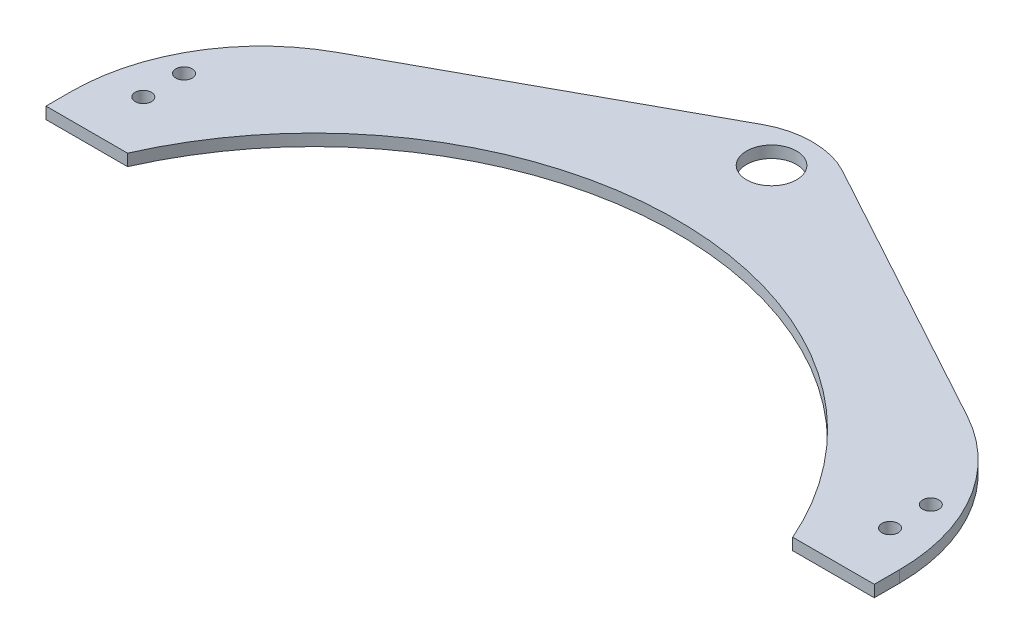
ISO-10303-21;
HEADER;
FILE_DESCRIPTION(('STEP AP214'),'2;1');
FILE_NAME('part.step','',(''),(''),'','','');
FILE_SCHEMA(('AUTOMOTIVE_DESIGN { 1 0 10303 214 1 1 1 1 }'));
ENDSEC;
DATA;
#1=APPLICATION_CONTEXT('core data for automotive mechanical design processes');
#2=APPLICATION_PROTOCOL_DEFINITION('international standard','automotive_design',2000,#1);
#3=PRODUCT_CONTEXT('',#1,'mechanical');
#4=PRODUCT('Part','Part','',(#3));
#5=PRODUCT_RELATED_PRODUCT_CATEGORY('part','',(#4));
#6=PRODUCT_DEFINITION_FORMATION('','',#4);
#7=PRODUCT_DEFINITION_CONTEXT('part definition',#1,'design');
#8=PRODUCT_DEFINITION('design','',#6,#7);
#9=PRODUCT_DEFINITION_SHAPE('','',#8);
#10=(LENGTH_UNIT() NAMED_UNIT(*) SI_UNIT(.MILLI.,.METRE.));
#11=(NAMED_UNIT(*) PLANE_ANGLE_UNIT() SI_UNIT($,.RADIAN.));
#12=(NAMED_UNIT(*) SI_UNIT($,.STERADIAN.) SOLID_ANGLE_UNIT());
#13=UNCERTAINTY_MEASURE_WITH_UNIT(LENGTH_MEASURE(1.E-05),#10,'distance_accuracy_value','');
#14=(GEOMETRIC_REPRESENTATION_CONTEXT(3) GLOBAL_UNCERTAINTY_ASSIGNED_CONTEXT((#13)) GLOBAL_UNIT_ASSIGNED_CONTEXT((#10,
#11,#12)) REPRESENTATION_CONTEXT('',''));
#15=CARTESIAN_POINT('',(0.,0.,0.));
#16=DIRECTION('',(0.,0.,1.));
#17=DIRECTION('',(1.,0.,0.));
#18=AXIS2_PLACEMENT_3D('',#15,#16,#17);
#19=CARTESIAN_POINT('',(-15.,3.175,0.));
#20=DIRECTION('',(-1.,0.,0.));
#21=DIRECTION('',(0.,0.,1.));
#22=AXIS2_PLACEMENT_3D('',#19,#20,#21);
#23=PLANE('',#22);
#24=DIRECTION('',(0.,0.,1.));
#25=VECTOR('',#24,1.);
#26=CARTESIAN_POINT('',(-15.,2.159,0.));
#27=LINE('',#26,#25);
#28=CARTESIAN_POINT('',(-15.,2.159,-4.62743413891278));
#29=VERTEX_POINT('',#28);
#30=CARTESIAN_POINT('',(-15.,2.159,0.));
#31=VERTEX_POINT('',#30);
#32=EDGE_CURVE('E128',#29,#31,#27,.T.);
#33=ORIENTED_EDGE('',*,*,#32,.F.);
#34=DIRECTION('',(0.,-1.,0.));
#35=VECTOR('',#34,1.);
#36=CARTESIAN_POINT('',(-15.,3.175,-4.62743413891278));
#37=LINE('',#36,#35);
#38=CARTESIAN_POINT('',(-15.,0.,-4.62743413891278));
#39=VERTEX_POINT('',#38);
#40=EDGE_CURVE('E61',#29,#39,#37,.T.);
#41=ORIENTED_EDGE('',*,*,#40,.T.);
#42=DIRECTION('',(0.,0.,-1.));
#43=VECTOR('',#42,1.);
#44=CARTESIAN_POINT('',(-15.,0.,0.));
#45=LINE('',#44,#43);
#46=CARTESIAN_POINT('',(-15.,0.,0.));
#47=VERTEX_POINT('',#46);
#48=EDGE_CURVE('E189',#47,#39,#45,.T.);
#49=ORIENTED_EDGE('',*,*,#48,.F.);
#50=DIRECTION('',(0.,-1.,0.));
#51=VECTOR('',#50,1.);
#52=CARTESIAN_POINT('',(-15.,3.175,0.));
#53=LINE('',#52,#51);
#54=EDGE_CURVE('E11',#31,#47,#53,.T.);
#55=ORIENTED_EDGE('',*,*,#54,.F.);
#56=EDGE_LOOP('',(#33,#41,#49,#55));
#57=FACE_BOUND('',#56,.T.);
#58=ADVANCED_FACE('F37',(#57),#23,.T.);
#59=CARTESIAN_POINT('',(0.,3.175,0.));
#60=DIRECTION('',(0.,0.,1.));
#61=DIRECTION('',(1.,0.,0.));
#62=AXIS2_PLACEMENT_3D('',#59,#60,#61);
#63=PLANE('',#62);
#64=DIRECTION('',(1.,0.,0.));
#65=VECTOR('',#64,1.);
#66=CARTESIAN_POINT('',(0.,2.159,0.));
#67=LINE('',#66,#65);
#68=CARTESIAN_POINT('',(0.,2.159,0.));
#69=VERTEX_POINT('',#68);
#70=EDGE_CURVE('E136',#31,#69,#67,.T.);
#71=ORIENTED_EDGE('',*,*,#70,.F.);
#72=ORIENTED_EDGE('',*,*,#54,.T.);
#73=DIRECTION('',(-1.,0.,0.));
#74=VECTOR('',#73,1.);
#75=CARTESIAN_POINT('',(0.,0.,0.));
#76=LINE('',#75,#74);
#77=CARTESIAN_POINT('',(0.,0.,0.));
#78=VERTEX_POINT('',#77);
#79=EDGE_CURVE('E183',#78,#47,#76,.T.);
#80=ORIENTED_EDGE('',*,*,#79,.F.);
#81=DIRECTION('',(0.,-1.,0.));
#82=VECTOR('',#81,1.);
#83=CARTESIAN_POINT('',(0.,3.175,0.));
#84=LINE('',#83,#82);
#85=EDGE_CURVE('E46',#69,#78,#84,.T.);
#86=ORIENTED_EDGE('',*,*,#85,.F.);
#87=EDGE_LOOP('',(#71,#72,#80,#86));
#88=FACE_BOUND('',#87,.T.);
#89=ADVANCED_FACE('F188',(#88),#63,.T.);
#90=CARTESIAN_POINT('',(61.2,3.175,26.9726267509548));
#91=DIRECTION('',(0.,-1.,0.));
#92=DIRECTION('',(0.,0.,-1.));
#93=AXIS2_PLACEMENT_3D('',#90,#91,#92);
#94=CYLINDRICAL_SURFACE('',#93,66.8802107790213);
#95=DIRECTION('',(0.,-1.,0.));
#96=VECTOR('',#95,1.);
#97=CARTESIAN_POINT('',(122.4,3.175,0.));
#98=LINE('',#97,#96);
#99=CARTESIAN_POINT('',(122.4,2.159,0.));
#100=VERTEX_POINT('',#99);
#101=CARTESIAN_POINT('',(122.4,0.,0.));
#102=VERTEX_POINT('',#101);
#103=EDGE_CURVE('E165',#100,#102,#98,.T.);
#104=ORIENTED_EDGE('',*,*,#103,.F.);
#105=CARTESIAN_POINT('',(61.2,2.159,26.9726267509548));
#106=DIRECTION('',(0.,-1.,0.));
#107=DIRECTION('',(0.,0.,-1.));
#108=AXIS2_PLACEMENT_3D('',#105,#106,#107);
#109=CIRCLE('',#108,66.8802107790213);
#110=EDGE_CURVE('E175',#100,#69,#109,.F.);
#111=ORIENTED_EDGE('',*,*,#110,.T.);
#112=ORIENTED_EDGE('',*,*,#85,.T.);
#113=CARTESIAN_POINT('',(61.2,0.,26.9726267509548));
#114=DIRECTION('',(0.,1.,0.));
#115=DIRECTION('',(0.,0.,1.));
#116=AXIS2_PLACEMENT_3D('',#113,#114,#115);
#117=CIRCLE('',#116,66.8802107790213);
#118=EDGE_CURVE('E174',#78,#102,#117,.F.);
#119=ORIENTED_EDGE('',*,*,#118,.T.);
#120=EDGE_LOOP('',(#104,#111,#112,#119));
#121=FACE_BOUND('',#120,.T.);
#122=ADVANCED_FACE('F173',(#121),#94,.F.);
#123=CARTESIAN_POINT('',(0.,3.175,0.));
#124=DIRECTION('',(0.,0.,-1.));
#125=DIRECTION('',(-1.,0.,0.));
#126=AXIS2_PLACEMENT_3D('',#123,#124,#125);
#127=PLANE('',#126);
#128=DIRECTION('',(0.,-1.,0.));
#129=VECTOR('',#128,1.);
#130=CARTESIAN_POINT('',(137.4,3.175,0.));
#131=LINE('',#130,#129);
#132=CARTESIAN_POINT('',(137.4,2.159,0.));
#133=VERTEX_POINT('',#132);
#134=CARTESIAN_POINT('',(137.4,0.,0.));
#135=VERTEX_POINT('',#134);
#136=EDGE_CURVE('E163',#133,#135,#131,.T.);
#137=ORIENTED_EDGE('',*,*,#136,.F.);
#138=DIRECTION('',(-1.,0.,0.));
#139=VECTOR('',#138,1.);
#140=CARTESIAN_POINT('',(0.,2.159,0.));
#141=LINE('',#140,#139);
#142=EDGE_CURVE('E273',#133,#100,#141,.T.);
#143=ORIENTED_EDGE('',*,*,#142,.T.);
#144=ORIENTED_EDGE('',*,*,#103,.T.);
#145=DIRECTION('',(1.,0.,0.));
#146=VECTOR('',#145,1.);
#147=CARTESIAN_POINT('',(0.,0.,0.));
#148=LINE('',#147,#146);
#149=EDGE_CURVE('E186',#102,#135,#148,.T.);
#150=ORIENTED_EDGE('',*,*,#149,.T.);
#151=EDGE_LOOP('',(#137,#143,#144,#150));
#152=FACE_BOUND('',#151,.T.);
#153=ADVANCED_FACE('F423',(#152),#127,.F.);
#154=CARTESIAN_POINT('',(137.4,3.175,0.));
#155=DIRECTION('',(-1.,0.,0.));
#156=DIRECTION('',(0.,0.,1.));
#157=AXIS2_PLACEMENT_3D('',#154,#155,#156);
#158=PLANE('',#157);
#159=DIRECTION('',(0.,-1.,0.));
#160=VECTOR('',#159,1.);
#161=CARTESIAN_POINT('',(137.4,3.175,-4.62743413891279));
#162=LINE('',#161,#160);
#163=CARTESIAN_POINT('',(137.4,2.159,-4.62743413891279));
#164=VERTEX_POINT('',#163);
#165=CARTESIAN_POINT('',(137.4,0.,-4.62743413891279));
#166=VERTEX_POINT('',#165);
#167=EDGE_CURVE('E161',#164,#166,#162,.T.);
#168=ORIENTED_EDGE('',*,*,#167,.F.);
#169=DIRECTION('',(0.,0.,1.));
#170=VECTOR('',#169,1.);
#171=CARTESIAN_POINT('',(137.4,2.159,0.));
#172=LINE('',#171,#170);
#173=EDGE_CURVE('E276',#164,#133,#172,.T.);
#174=ORIENTED_EDGE('',*,*,#173,.T.);
#175=ORIENTED_EDGE('',*,*,#136,.T.);
#176=DIRECTION('',(0.,0.,-1.));
#177=VECTOR('',#176,1.);
#178=CARTESIAN_POINT('',(137.4,0.,0.));
#179=LINE('',#178,#177);
#180=EDGE_CURVE('E196',#135,#166,#179,.T.);
#181=ORIENTED_EDGE('',*,*,#180,.T.);
#182=EDGE_LOOP('',(#168,#174,#175,#181));
#183=FACE_BOUND('',#182,.T.);
#184=ADVANCED_FACE('F413',(#183),#158,.F.);
#185=CARTESIAN_POINT('',(102.4,3.175,-4.62743413891278));
#186=DIRECTION('',(0.,-1.,0.));
#187=DIRECTION('',(0.,0.,-1.));
#188=AXIS2_PLACEMENT_3D('',#185,#186,#187);
#189=CYLINDRICAL_SURFACE('',#188,35.);
#190=CARTESIAN_POINT('',(102.4,2.159,-4.62743413891278));
#191=DIRECTION('',(0.,-1.,0.));
#192=DIRECTION('',(0.,0.,-1.));
#193=AXIS2_PLACEMENT_3D('',#190,#191,#192);
#194=CIRCLE('',#193,35.);
#195=CARTESIAN_POINT('',(119.165787065233,2.159,-35.3505261721579));
#196=VERTEX_POINT('',#195);
#197=EDGE_CURVE('E279',#164,#196,#194,.F.);
#198=ORIENTED_EDGE('',*,*,#197,.F.);
#199=ORIENTED_EDGE('',*,*,#167,.T.);
#200=CARTESIAN_POINT('',(102.4,0.,-4.62743413891278));
#201=DIRECTION('',(0.,1.,0.));
#202=DIRECTION('',(0.,0.,1.));
#203=AXIS2_PLACEMENT_3D('',#200,#201,#202);
#204=CIRCLE('',#203,35.);
#205=CARTESIAN_POINT('',(119.165787065233,0.,-35.3505261721579));
#206=VERTEX_POINT('',#205);
#207=EDGE_CURVE('E199',#206,#166,#204,.F.);
#208=ORIENTED_EDGE('',*,*,#207,.F.);
#209=DIRECTION('',(0.,-1.,0.));
#210=VECTOR('',#209,1.);
#211=CARTESIAN_POINT('',(119.165787065233,3.175,-35.3505261721579));
#212=LINE('',#211,#210);
#213=EDGE_CURVE('E159',#196,#206,#212,.T.);
#214=ORIENTED_EDGE('',*,*,#213,.F.);
#215=EDGE_LOOP('',(#198,#199,#208,#214));
#216=FACE_BOUND('',#215,.T.);
#217=ADVANCED_FACE('F402',(#216),#189,.T.);
#218=CARTESIAN_POINT('',(42.2085283509727,3.175,-77.3465925619346));
#219=DIRECTION('',(0.4790224875781,0.,-0.877802629521289));
#220=DIRECTION('',(-0.877802629521289,0.,-0.4790224875781));
#221=AXIS2_PLACEMENT_3D('',#218,#219,#220);
#222=PLANE('',#221);
#223=DIRECTION('',(-0.877802629521289,0.,-0.4790224875781));
#224=VECTOR('',#223,1.);
#225=CARTESIAN_POINT('',(42.2085283509727,2.159,-77.3465925619346));
#226=LINE('',#225,#224);
#227=CARTESIAN_POINT('',(68.5588769601128,2.159,-62.9670394428193));
#228=VERTEX_POINT('',#227);
#229=EDGE_CURVE('E281',#196,#228,#226,.T.);
#230=ORIENTED_EDGE('',*,*,#229,.F.);
#231=ORIENTED_EDGE('',*,*,#213,.T.);
#232=DIRECTION('',(0.877802629521289,0.,0.4790224875781));
#233=VECTOR('',#232,1.);
#234=CARTESIAN_POINT('',(42.2085283509727,0.,-77.3465925619346));
#235=LINE('',#234,#233);
#236=CARTESIAN_POINT('',(68.5588769601128,0.,-62.9670394428193));
#237=VERTEX_POINT('',#236);
#238=EDGE_CURVE('E202',#237,#206,#235,.T.);
#239=ORIENTED_EDGE('',*,*,#238,.F.);
#240=DIRECTION('',(0.,-1.,0.));
#241=VECTOR('',#240,1.);
#242=CARTESIAN_POINT('',(68.5588769601128,3.175,-62.9670394428193));
#243=LINE('',#242,#241);
#244=EDGE_CURVE('E157',#228,#237,#243,.T.);
#245=ORIENTED_EDGE('',*,*,#244,.F.);
#246=EDGE_LOOP('',(#230,#231,#239,#245));
#247=FACE_BOUND('',#246,.T.);
#248=ADVANCED_FACE('F392',(#247),#222,.T.);
#249=CARTESIAN_POINT('',(61.3735396464413,3.175,-49.8));
#250=DIRECTION('',(0.,-1.,0.));
#251=DIRECTION('',(0.,0.,-1.));
#252=AXIS2_PLACEMENT_3D('',#249,#250,#251);
#253=CYLINDRICAL_SURFACE('',#252,15.);
#254=CARTESIAN_POINT('',(61.3735396464413,2.159,-49.8));
#255=DIRECTION('',(0.,-1.,0.));
#256=DIRECTION('',(0.,0.,-1.));
#257=AXIS2_PLACEMENT_3D('',#254,#255,#256);
#258=CIRCLE('',#257,15.);
#259=CARTESIAN_POINT('',(61.3735396464413,2.159,-64.8));
#260=VERTEX_POINT('',#259);
#261=EDGE_CURVE('E283',#228,#260,#258,.F.);
#262=ORIENTED_EDGE('',*,*,#261,.F.);
#263=ORIENTED_EDGE('',*,*,#244,.T.);
#264=CARTESIAN_POINT('',(61.3735396464413,0.,-49.8));
#265=DIRECTION('',(0.,1.,0.));
#266=DIRECTION('',(0.,0.,1.));
#267=AXIS2_PLACEMENT_3D('',#264,#265,#266);
#268=CIRCLE('',#267,15.);
#269=CARTESIAN_POINT('',(61.3735396464413,0.,-64.8));
#270=VERTEX_POINT('',#269);
#271=EDGE_CURVE('E205',#270,#237,#268,.F.);
#272=ORIENTED_EDGE('',*,*,#271,.F.);
#273=DIRECTION('',(0.,-1.,0.));
#274=VECTOR('',#273,1.);
#275=CARTESIAN_POINT('',(61.3735396464413,3.175,-64.8));
#276=LINE('',#275,#274);
#277=EDGE_CURVE('E155',#260,#270,#276,.T.);
#278=ORIENTED_EDGE('',*,*,#277,.F.);
#279=EDGE_LOOP('',(#262,#263,#272,#278));
#280=FACE_BOUND('',#279,.T.);
#281=ADVANCED_FACE('F381',(#280),#253,.T.);
#282=CARTESIAN_POINT('',(0.,3.175,-64.8));
#283=DIRECTION('',(0.,0.,1.));
#284=DIRECTION('',(1.,0.,0.));
#285=AXIS2_PLACEMENT_3D('',#282,#283,#284);
#286=PLANE('',#285);
#287=DIRECTION('',(0.,-1.,0.));
#288=VECTOR('',#287,1.);
#289=CARTESIAN_POINT('',(61.0264603535587,3.175,-64.8));
#290=LINE('',#289,#288);
#291=CARTESIAN_POINT('',(61.0264603535587,2.159,-64.8));
#292=VERTEX_POINT('',#291);
#293=CARTESIAN_POINT('',(61.0264603535587,0.,-64.8));
#294=VERTEX_POINT('',#293);
#295=EDGE_CURVE('E153',#292,#294,#290,.T.);
#296=ORIENTED_EDGE('',*,*,#295,.F.);
#297=DIRECTION('',(1.,0.,0.));
#298=VECTOR('',#297,1.);
#299=CARTESIAN_POINT('',(0.,2.159,-64.8));
#300=LINE('',#299,#298);
#301=EDGE_CURVE('E285',#292,#260,#300,.T.);
#302=ORIENTED_EDGE('',*,*,#301,.T.);
#303=ORIENTED_EDGE('',*,*,#277,.T.);
#304=DIRECTION('',(-1.,0.,0.));
#305=VECTOR('',#304,1.);
#306=CARTESIAN_POINT('',(0.,0.,-64.8));
#307=LINE('',#306,#305);
#308=EDGE_CURVE('E208',#270,#294,#307,.T.);
#309=ORIENTED_EDGE('',*,*,#308,.T.);
#310=EDGE_LOOP('',(#296,#302,#303,#309));
#311=FACE_BOUND('',#310,.T.);
#312=ADVANCED_FACE('F371',(#311),#286,.F.);
#313=CARTESIAN_POINT('',(61.0264603535587,3.175,-49.8));
#314=DIRECTION('',(0.,-1.,0.));
#315=DIRECTION('',(0.,0.,-1.));
#316=AXIS2_PLACEMENT_3D('',#313,#314,#315);
#317=CYLINDRICAL_SURFACE('',#316,15.);
#318=DIRECTION('',(0.,-1.,0.));
#319=VECTOR('',#318,1.);
#320=CARTESIAN_POINT('',(53.8411230398872,3.175,-62.9670394428193));
#321=LINE('',#320,#319);
#322=CARTESIAN_POINT('',(53.8411230398872,2.159,-62.9670394428193));
#323=VERTEX_POINT('',#322);
#324=CARTESIAN_POINT('',(53.8411230398872,0.,-62.9670394428193));
#325=VERTEX_POINT('',#324);
#326=EDGE_CURVE('E145',#323,#325,#321,.T.);
#327=ORIENTED_EDGE('',*,*,#326,.F.);
#328=CARTESIAN_POINT('',(61.0264603535587,2.159,-49.8));
#329=DIRECTION('',(0.,-1.,0.));
#330=DIRECTION('',(0.,0.,-1.));
#331=AXIS2_PLACEMENT_3D('',#328,#329,#330);
#332=CIRCLE('',#331,15.);
#333=EDGE_CURVE('E288',#323,#292,#332,.T.);
#334=ORIENTED_EDGE('',*,*,#333,.T.);
#335=ORIENTED_EDGE('',*,*,#295,.T.);
#336=CARTESIAN_POINT('',(61.0264603535587,0.,-49.8));
#337=DIRECTION('',(0.,1.,0.));
#338=DIRECTION('',(0.,0.,1.));
#339=AXIS2_PLACEMENT_3D('',#336,#337,#338);
#340=CIRCLE('',#339,15.);
#341=EDGE_CURVE('E211',#294,#325,#340,.T.);
#342=ORIENTED_EDGE('',*,*,#341,.T.);
#343=EDGE_LOOP('',(#327,#334,#335,#342));
#344=FACE_BOUND('',#343,.T.);
#345=ADVANCED_FACE('F232',(#344),#317,.T.);
#346=CARTESIAN_POINT('',(-14.1223130136581,3.175,-25.8789593803583));
#347=DIRECTION('',(0.479022487578099,0.,0.877802629521289));
#348=DIRECTION('',(0.877802629521289,0.,-0.479022487578099));
#349=AXIS2_PLACEMENT_3D('',#346,#347,#348);
#350=PLANE('',#349);
#351=DIRECTION('',(0.,-1.,0.));
#352=VECTOR('',#351,1.);
#353=CARTESIAN_POINT('',(3.23421293476652,3.175,-35.3505261721579));
#354=LINE('',#353,#352);
#355=CARTESIAN_POINT('',(3.23421293476652,2.159,-35.3505261721579));
#356=VERTEX_POINT('',#355);
#357=CARTESIAN_POINT('',(3.23421293476652,0.,-35.3505261721579));
#358=VERTEX_POINT('',#357);
#359=EDGE_CURVE('E142',#356,#358,#354,.T.);
#360=ORIENTED_EDGE('',*,*,#359,.F.);
#361=DIRECTION('',(0.877802629521289,0.,-0.479022487578099));
#362=VECTOR('',#361,1.);
#363=CARTESIAN_POINT('',(-14.1223130136581,2.159,-25.8789593803583));
#364=LINE('',#363,#362);
#365=EDGE_CURVE('E53',#356,#323,#364,.T.);
#366=ORIENTED_EDGE('',*,*,#365,.T.);
#367=ORIENTED_EDGE('',*,*,#326,.T.);
#368=DIRECTION('',(-0.877802629521289,0.,0.479022487578099));
#369=VECTOR('',#368,1.);
#370=CARTESIAN_POINT('',(-14.1223130136581,0.,-25.8789593803583));
#371=LINE('',#370,#369);
#372=EDGE_CURVE('E214',#325,#358,#371,.T.);
#373=ORIENTED_EDGE('',*,*,#372,.T.);
#374=EDGE_LOOP('',(#360,#366,#367,#373));
#375=FACE_BOUND('',#374,.T.);
#376=ADVANCED_FACE('F223',(#375),#350,.F.);
#377=CARTESIAN_POINT('',(129.9,3.175,-10.4));
#378=DIRECTION('',(0.,-1.,0.));
#379=DIRECTION('',(0.,0.,-1.));
#380=AXIS2_PLACEMENT_3D('',#377,#378,#379);
#381=CYLINDRICAL_SURFACE('',#380,1.5);
#382=CARTESIAN_POINT('',(129.9,2.159,-10.4));
#383=DIRECTION('',(0.,-1.,0.));
#384=DIRECTION('',(0.,0.,-1.));
#385=AXIS2_PLACEMENT_3D('',#382,#383,#384);
#386=CIRCLE('',#385,1.5);
#387=CARTESIAN_POINT('',(129.9,2.159,-11.9));
#388=VERTEX_POINT('',#387);
#389=EDGE_CURVE('E135',#388,#388,#386,.T.);
#390=ORIENTED_EDGE('',*,*,#389,.F.);
#391=EDGE_LOOP('',(#390));
#392=FACE_BOUND('',#391,.T.);
#393=CARTESIAN_POINT('',(129.9,0.,-10.4));
#394=DIRECTION('',(0.,1.,0.));
#395=DIRECTION('',(0.,0.,1.));
#396=AXIS2_PLACEMENT_3D('',#393,#394,#395);
#397=CIRCLE('',#396,1.5);
#398=CARTESIAN_POINT('',(129.9,0.,-8.9));
#399=VERTEX_POINT('',#398);
#400=EDGE_CURVE('E148',#399,#399,#397,.T.);
#401=ORIENTED_EDGE('',*,*,#400,.F.);
#402=EDGE_LOOP('',(#401));
#403=FACE_BOUND('',#402,.T.);
#404=ADVANCED_FACE('F221',(#392,#403),#381,.F.);
#405=CARTESIAN_POINT('',(20.,3.175,-4.62743413891279));
#406=DIRECTION('',(0.,-1.,0.));
#407=DIRECTION('',(0.,0.,-1.));
#408=AXIS2_PLACEMENT_3D('',#405,#406,#407);
#409=CYLINDRICAL_SURFACE('',#408,35.);
#410=ORIENTED_EDGE('',*,*,#40,.F.);
#411=CARTESIAN_POINT('',(20.,2.159,-4.62743413891279));
#412=DIRECTION('',(0.,-1.,0.));
#413=DIRECTION('',(0.,0.,-1.));
#414=AXIS2_PLACEMENT_3D('',#411,#412,#413);
#415=CIRCLE('',#414,35.);
#416=EDGE_CURVE('E125',#29,#356,#415,.T.);
#417=ORIENTED_EDGE('',*,*,#416,.T.);
#418=ORIENTED_EDGE('',*,*,#359,.T.);
#419=CARTESIAN_POINT('',(20.,0.,-4.62743413891279));
#420=DIRECTION('',(0.,1.,0.));
#421=DIRECTION('',(0.,0.,1.));
#422=AXIS2_PLACEMENT_3D('',#419,#420,#421);
#423=CIRCLE('',#422,35.);
#424=EDGE_CURVE('E140',#358,#39,#423,.T.);
#425=ORIENTED_EDGE('',*,*,#424,.T.);
#426=EDGE_LOOP('',(#410,#417,#418,#425));
#427=FACE_BOUND('',#426,.T.);
#428=ADVANCED_FACE('F138',(#427),#409,.T.);
#429=CARTESIAN_POINT('',(-7.5,3.175,-17.9));
#430=DIRECTION('',(0.,-1.,0.));
#431=DIRECTION('',(0.,0.,-1.));
#432=AXIS2_PLACEMENT_3D('',#429,#430,#431);
#433=CYLINDRICAL_SURFACE('',#432,1.5);
#434=CARTESIAN_POINT('',(-7.5,2.159,-17.9));
#435=DIRECTION('',(0.,-1.,0.));
#436=DIRECTION('',(0.,0.,-1.));
#437=AXIS2_PLACEMENT_3D('',#434,#435,#436);
#438=CIRCLE('',#437,1.5);
#439=CARTESIAN_POINT('',(-7.5,2.159,-19.4));
#440=VERTEX_POINT('',#439);
#441=EDGE_CURVE('E132',#440,#440,#438,.T.);
#442=ORIENTED_EDGE('',*,*,#441,.F.);
#443=EDGE_LOOP('',(#442));
#444=FACE_BOUND('',#443,.T.);
#445=CARTESIAN_POINT('',(-7.5,0.,-17.9));
#446=DIRECTION('',(0.,1.,0.));
#447=DIRECTION('',(0.,0.,1.));
#448=AXIS2_PLACEMENT_3D('',#445,#446,#447);
#449=CIRCLE('',#448,1.5);
#450=CARTESIAN_POINT('',(-7.5,0.,-16.4));
#451=VERTEX_POINT('',#450);
#452=EDGE_CURVE('E191',#451,#451,#449,.T.);
#453=ORIENTED_EDGE('',*,*,#452,.F.);
#454=EDGE_LOOP('',(#453));
#455=FACE_BOUND('',#454,.T.);
#456=ADVANCED_FACE('F230',(#444,#455),#433,.F.);
#457=CARTESIAN_POINT('',(-7.5,3.175,-10.4));
#458=DIRECTION('',(0.,-1.,0.));
#459=DIRECTION('',(0.,0.,-1.));
#460=AXIS2_PLACEMENT_3D('',#457,#458,#459);
#461=CYLINDRICAL_SURFACE('',#460,1.5);
#462=CARTESIAN_POINT('',(-7.5,2.159,-10.4));
#463=DIRECTION('',(0.,-1.,0.));
#464=DIRECTION('',(0.,0.,-1.));
#465=AXIS2_PLACEMENT_3D('',#462,#463,#464);
#466=CIRCLE('',#465,1.5);
#467=CARTESIAN_POINT('',(-7.5,2.159,-11.9));
#468=VERTEX_POINT('',#467);
#469=EDGE_CURVE('E258',#468,#468,#466,.T.);
#470=ORIENTED_EDGE('',*,*,#469,.F.);
#471=EDGE_LOOP('',(#470));
#472=FACE_BOUND('',#471,.T.);
#473=CARTESIAN_POINT('',(-7.5,0.,-10.4));
#474=DIRECTION('',(0.,1.,0.));
#475=DIRECTION('',(0.,0.,1.));
#476=AXIS2_PLACEMENT_3D('',#473,#474,#475);
#477=CIRCLE('',#476,1.5);
#478=CARTESIAN_POINT('',(-7.5,0.,-8.9));
#479=VERTEX_POINT('',#478);
#480=EDGE_CURVE('E261',#479,#479,#477,.T.);
#481=ORIENTED_EDGE('',*,*,#480,.F.);
#482=EDGE_LOOP('',(#481));
#483=FACE_BOUND('',#482,.T.);
#484=ADVANCED_FACE('F246',(#472,#483),#461,.F.);
#485=CARTESIAN_POINT('',(61.2,3.175,-57.3));
#486=DIRECTION('',(0.,-1.,0.));
#487=DIRECTION('',(0.,0.,-1.));
#488=AXIS2_PLACEMENT_3D('',#485,#486,#487);
#489=CYLINDRICAL_SURFACE('',#488,4.6);
#490=CARTESIAN_POINT('',(61.2,2.159,-57.3));
#491=DIRECTION('',(0.,-1.,0.));
#492=DIRECTION('',(0.,0.,-1.));
#493=AXIS2_PLACEMENT_3D('',#490,#491,#492);
#494=CIRCLE('',#493,4.6);
#495=CARTESIAN_POINT('',(61.2,2.159,-61.9));
#496=VERTEX_POINT('',#495);
#497=EDGE_CURVE('E295',#496,#496,#494,.T.);
#498=ORIENTED_EDGE('',*,*,#497,.F.);
#499=EDGE_LOOP('',(#498));
#500=FACE_BOUND('',#499,.T.);
#501=CARTESIAN_POINT('',(61.2,0.,-57.3));
#502=DIRECTION('',(0.,1.,0.));
#503=DIRECTION('',(0.,0.,1.));
#504=AXIS2_PLACEMENT_3D('',#501,#502,#503);
#505=CIRCLE('',#504,4.6);
#506=CARTESIAN_POINT('',(61.2,0.,-52.7));
#507=VERTEX_POINT('',#506);
#508=EDGE_CURVE('E263',#507,#507,#505,.T.);
#509=ORIENTED_EDGE('',*,*,#508,.F.);
#510=EDGE_LOOP('',(#509));
#511=FACE_BOUND('',#510,.T.);
#512=ADVANCED_FACE('F39',(#500,#511),#489,.F.);
#513=CARTESIAN_POINT('',(129.9,3.175,-17.9));
#514=DIRECTION('',(0.,-1.,0.));
#515=DIRECTION('',(0.,0.,-1.));
#516=AXIS2_PLACEMENT_3D('',#513,#514,#515);
#517=CYLINDRICAL_SURFACE('',#516,1.5);
#518=CARTESIAN_POINT('',(129.9,2.159,-17.9));
#519=DIRECTION('',(0.,-1.,0.));
#520=DIRECTION('',(0.,0.,-1.));
#521=AXIS2_PLACEMENT_3D('',#518,#519,#520);
#522=CIRCLE('',#521,1.5);
#523=CARTESIAN_POINT('',(129.9,2.159,-19.4));
#524=VERTEX_POINT('',#523);
#525=EDGE_CURVE('E41',#524,#524,#522,.T.);
#526=ORIENTED_EDGE('',*,*,#525,.F.);
#527=EDGE_LOOP('',(#526));
#528=FACE_BOUND('',#527,.T.);
#529=CARTESIAN_POINT('',(129.9,0.,-17.9));
#530=DIRECTION('',(0.,1.,0.));
#531=DIRECTION('',(0.,0.,1.));
#532=AXIS2_PLACEMENT_3D('',#529,#530,#531);
#533=CIRCLE('',#532,1.5);
#534=CARTESIAN_POINT('',(129.9,0.,-16.4));
#535=VERTEX_POINT('',#534);
#536=EDGE_CURVE('E143',#535,#535,#533,.T.);
#537=ORIENTED_EDGE('',*,*,#536,.F.);
#538=EDGE_LOOP('',(#537));
#539=FACE_BOUND('',#538,.T.);
#540=ADVANCED_FACE('F253',(#528,#539),#517,.F.);
#541=CARTESIAN_POINT('',(0.,0.,0.));
#542=DIRECTION('',(0.,1.,0.));
#543=DIRECTION('',(0.,0.,1.));
#544=AXIS2_PLACEMENT_3D('',#541,#542,#543);
#545=PLANE('',#544);
#546=ORIENTED_EDGE('',*,*,#508,.T.);
#547=EDGE_LOOP('',(#546));
#548=FACE_BOUND('',#547,.T.);
#549=ORIENTED_EDGE('',*,*,#480,.T.);
#550=EDGE_LOOP('',(#549));
#551=FACE_BOUND('',#550,.T.);
#552=ORIENTED_EDGE('',*,*,#452,.T.);
#553=EDGE_LOOP('',(#552));
#554=FACE_BOUND('',#553,.T.);
#555=ORIENTED_EDGE('',*,*,#48,.T.);
#556=ORIENTED_EDGE('',*,*,#424,.F.);
#557=ORIENTED_EDGE('',*,*,#372,.F.);
#558=ORIENTED_EDGE('',*,*,#341,.F.);
#559=ORIENTED_EDGE('',*,*,#308,.F.);
#560=ORIENTED_EDGE('',*,*,#271,.T.);
#561=ORIENTED_EDGE('',*,*,#238,.T.);
#562=ORIENTED_EDGE('',*,*,#207,.T.);
#563=ORIENTED_EDGE('',*,*,#180,.F.);
#564=ORIENTED_EDGE('',*,*,#149,.F.);
#565=ORIENTED_EDGE('',*,*,#118,.F.);
#566=ORIENTED_EDGE('',*,*,#79,.T.);
#567=EDGE_LOOP('',(#555,#556,#557,#558,#559,#560,#561,#562,#563,#564,#565,#566));
#568=FACE_BOUND('',#567,.T.);
#569=ORIENTED_EDGE('',*,*,#400,.T.);
#570=EDGE_LOOP('',(#569));
#571=FACE_BOUND('',#570,.T.);
#572=ORIENTED_EDGE('',*,*,#536,.T.);
#573=EDGE_LOOP('',(#572));
#574=FACE_BOUND('',#573,.T.);
#575=ADVANCED_FACE('F181',(#548,#551,#554,#568,#571,#574),#545,.F.);
#576=CARTESIAN_POINT('',(0.,2.159,0.));
#577=DIRECTION('',(0.,-1.,0.));
#578=DIRECTION('',(0.,0.,-1.));
#579=AXIS2_PLACEMENT_3D('',#576,#577,#578);
#580=PLANE('',#579);
#581=ORIENTED_EDGE('',*,*,#389,.T.);
#582=EDGE_LOOP('',(#581));
#583=FACE_BOUND('',#582,.T.);
#584=ORIENTED_EDGE('',*,*,#32,.T.);
#585=ORIENTED_EDGE('',*,*,#70,.T.);
#586=ORIENTED_EDGE('',*,*,#110,.F.);
#587=ORIENTED_EDGE('',*,*,#142,.F.);
#588=ORIENTED_EDGE('',*,*,#173,.F.);
#589=ORIENTED_EDGE('',*,*,#197,.T.);
#590=ORIENTED_EDGE('',*,*,#229,.T.);
#591=ORIENTED_EDGE('',*,*,#261,.T.);
#592=ORIENTED_EDGE('',*,*,#301,.F.);
#593=ORIENTED_EDGE('',*,*,#333,.F.);
#594=ORIENTED_EDGE('',*,*,#365,.F.);
#595=ORIENTED_EDGE('',*,*,#416,.F.);
#596=EDGE_LOOP('',(#584,#585,#586,#587,#588,#589,#590,#591,#592,#593,#594,#595));
#597=FACE_BOUND('',#596,.T.);
#598=ORIENTED_EDGE('',*,*,#441,.T.);
#599=EDGE_LOOP('',(#598));
#600=FACE_BOUND('',#599,.T.);
#601=ORIENTED_EDGE('',*,*,#469,.T.);
#602=EDGE_LOOP('',(#601));
#603=FACE_BOUND('',#602,.T.);
#604=ORIENTED_EDGE('',*,*,#497,.T.);
#605=EDGE_LOOP('',(#604));
#606=FACE_BOUND('',#605,.T.);
#607=ORIENTED_EDGE('',*,*,#525,.T.);
#608=EDGE_LOOP('',(#607));
#609=FACE_BOUND('',#608,.T.);
#610=ADVANCED_FACE('F126',(#583,#597,#600,#603,#606,#609),#580,.F.);
#611=CLOSED_SHELL('',(#58,#89,#122,#153,#184,#217,#248,#281,#312,#345,#376,#404,#428,#456,#484,
#512,#540,#575,#610));
#612=MANIFOLD_SOLID_BREP('B2',#611);
#613=ADVANCED_BREP_SHAPE_REPRESENTATION('',(#18,#612),#14);
#614=SHAPE_DEFINITION_REPRESENTATION(#9,#613);
ENDSEC;
END-ISO-10303-21;
